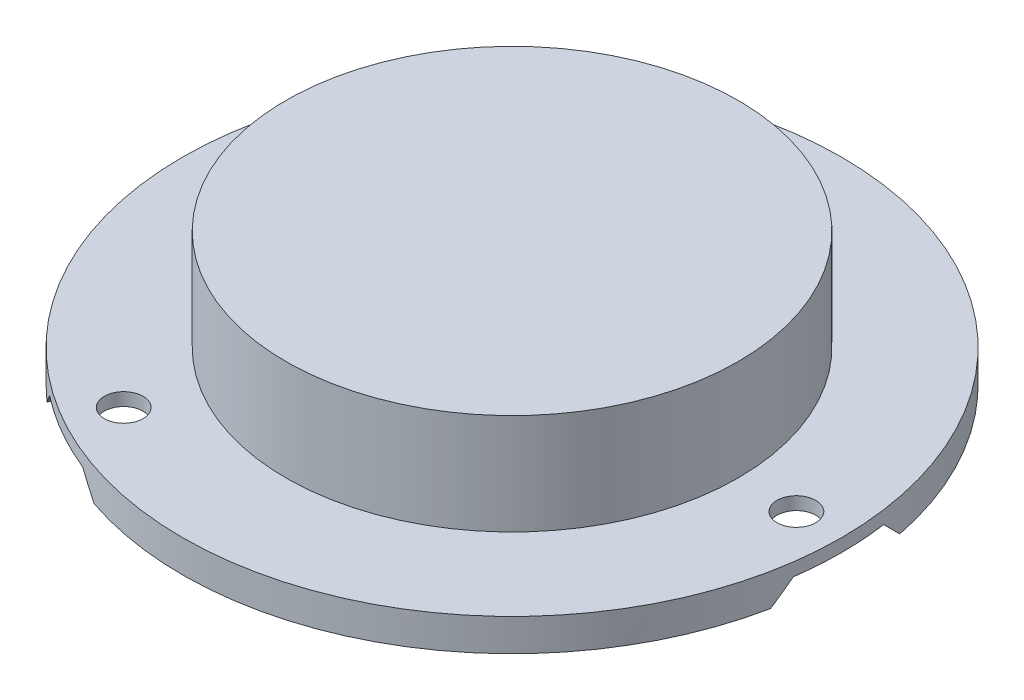
ISO-10303-21;
HEADER;
FILE_DESCRIPTION(('STEP AP214'),'2;1');
FILE_NAME('part.step','',(''),(''),'','','');
FILE_SCHEMA(('AUTOMOTIVE_DESIGN { 1 0 10303 214 1 1 1 1 }'));
ENDSEC;
DATA;
#1=APPLICATION_CONTEXT('core data for automotive mechanical design processes');
#2=APPLICATION_PROTOCOL_DEFINITION('international standard','automotive_design',2000,#1);
#3=PRODUCT_CONTEXT('',#1,'mechanical');
#4=PRODUCT('Part','Part','',(#3));
#5=PRODUCT_RELATED_PRODUCT_CATEGORY('part','',(#4));
#6=PRODUCT_DEFINITION_FORMATION('','',#4);
#7=PRODUCT_DEFINITION_CONTEXT('part definition',#1,'design');
#8=PRODUCT_DEFINITION('design','',#6,#7);
#9=PRODUCT_DEFINITION_SHAPE('','',#8);
#10=(LENGTH_UNIT() NAMED_UNIT(*) SI_UNIT(.MILLI.,.METRE.));
#11=(NAMED_UNIT(*) PLANE_ANGLE_UNIT() SI_UNIT($,.RADIAN.));
#12=(NAMED_UNIT(*) SI_UNIT($,.STERADIAN.) SOLID_ANGLE_UNIT());
#13=UNCERTAINTY_MEASURE_WITH_UNIT(LENGTH_MEASURE(1.E-05),#10,'distance_accuracy_value','');
#14=(GEOMETRIC_REPRESENTATION_CONTEXT(3) GLOBAL_UNCERTAINTY_ASSIGNED_CONTEXT((#13)) GLOBAL_UNIT_ASSIGNED_CONTEXT((#10,
#11,#12)) REPRESENTATION_CONTEXT('',''));
#15=CARTESIAN_POINT('',(0.,0.,0.));
#16=DIRECTION('',(0.,0.,1.));
#17=DIRECTION('',(1.,0.,0.));
#18=AXIS2_PLACEMENT_3D('',#15,#16,#17);
#19=CARTESIAN_POINT('',(-11.0000000000001,0.,-19.0525588832576));
#20=DIRECTION('',(0.,-1.,0.));
#21=DIRECTION('',(0.,0.,-1.));
#22=AXIS2_PLACEMENT_3D('',#19,#20,#21);
#23=CYLINDRICAL_SURFACE('',#22,1.5);
#24=CARTESIAN_POINT('',(-11.0000000000001,2.5,-19.0525588832576));
#25=DIRECTION('',(0.,1.,0.));
#26=DIRECTION('',(-1.,0.,0.));
#27=AXIS2_PLACEMENT_3D('',#24,#25,#26);
#28=CIRCLE('',#27,1.5);
#29=CARTESIAN_POINT('',(-12.5000000000001,2.5,-19.0525588832576));
#30=VERTEX_POINT('',#29);
#31=EDGE_CURVE('E267',#30,#30,#28,.T.);
#32=ORIENTED_EDGE('',*,*,#31,.T.);
#33=EDGE_LOOP('',(#32));
#34=FACE_BOUND('',#33,.T.);
#35=CARTESIAN_POINT('',(-11.0000000000001,1.5,-19.0525588832576));
#36=DIRECTION('',(0.,-1.,0.));
#37=DIRECTION('',(0.,0.,-1.));
#38=AXIS2_PLACEMENT_3D('',#35,#36,#37);
#39=CIRCLE('',#38,1.5);
#40=CARTESIAN_POINT('',(-11.0000000000001,1.5,-20.5525588832576));
#41=VERTEX_POINT('',#40);
#42=EDGE_CURVE('E258',#41,#41,#39,.F.);
#43=ORIENTED_EDGE('',*,*,#42,.F.);
#44=EDGE_LOOP('',(#43));
#45=FACE_BOUND('',#44,.T.);
#46=ADVANCED_FACE('F47',(#34,#45),#23,.F.);
#47=CARTESIAN_POINT('',(-10.9999999999998,0.,19.0525588832577));
#48=DIRECTION('',(0.,-1.,0.));
#49=DIRECTION('',(0.,0.,-1.));
#50=AXIS2_PLACEMENT_3D('',#47,#48,#49);
#51=CYLINDRICAL_SURFACE('',#50,1.5);
#52=CARTESIAN_POINT('',(-10.9999999999998,2.5,19.0525588832577));
#53=DIRECTION('',(0.,1.,0.));
#54=DIRECTION('',(-1.,0.,0.));
#55=AXIS2_PLACEMENT_3D('',#52,#53,#54);
#56=CIRCLE('',#55,1.5);
#57=CARTESIAN_POINT('',(-12.4999999999998,2.5,19.0525588832577));
#58=VERTEX_POINT('',#57);
#59=EDGE_CURVE('E263',#58,#58,#56,.T.);
#60=ORIENTED_EDGE('',*,*,#59,.T.);
#61=EDGE_LOOP('',(#60));
#62=FACE_BOUND('',#61,.T.);
#63=CARTESIAN_POINT('',(-10.9999999999998,1.5,19.0525588832577));
#64=DIRECTION('',(0.,-1.,0.));
#65=DIRECTION('',(0.,0.,-1.));
#66=AXIS2_PLACEMENT_3D('',#63,#64,#65);
#67=CIRCLE('',#66,1.5);
#68=CARTESIAN_POINT('',(-10.9999999999998,1.5,17.5525588832578));
#69=VERTEX_POINT('',#68);
#70=EDGE_CURVE('E243',#69,#69,#67,.F.);
#71=ORIENTED_EDGE('',*,*,#70,.F.);
#72=EDGE_LOOP('',(#71));
#73=FACE_BOUND('',#72,.T.);
#74=ADVANCED_FACE('F464',(#62,#73),#51,.F.);
#75=CARTESIAN_POINT('',(22.,0.,0.));
#76=DIRECTION('',(0.,-1.,0.));
#77=DIRECTION('',(0.,0.,-1.));
#78=AXIS2_PLACEMENT_3D('',#75,#76,#77);
#79=CYLINDRICAL_SURFACE('',#78,1.5);
#80=CARTESIAN_POINT('',(22.,2.5,0.));
#81=DIRECTION('',(0.,1.,0.));
#82=DIRECTION('',(-1.,0.,0.));
#83=AXIS2_PLACEMENT_3D('',#80,#81,#82);
#84=CIRCLE('',#83,1.5);
#85=CARTESIAN_POINT('',(20.5,2.5,0.));
#86=VERTEX_POINT('',#85);
#87=EDGE_CURVE('E288',#86,#86,#84,.T.);
#88=ORIENTED_EDGE('',*,*,#87,.T.);
#89=EDGE_LOOP('',(#88));
#90=FACE_BOUND('',#89,.T.);
#91=CARTESIAN_POINT('',(22.,1.5,0.));
#92=DIRECTION('',(0.,-1.,0.));
#93=DIRECTION('',(1.,0.,0.));
#94=AXIS2_PLACEMENT_3D('',#91,#92,#93);
#95=CIRCLE('',#94,1.5);
#96=CARTESIAN_POINT('',(23.5,1.5,0.));
#97=VERTEX_POINT('',#96);
#98=EDGE_CURVE('E283',#97,#97,#95,.F.);
#99=ORIENTED_EDGE('',*,*,#98,.F.);
#100=EDGE_LOOP('',(#99));
#101=FACE_BOUND('',#100,.T.);
#102=ADVANCED_FACE('F461',(#90,#101),#79,.F.);
#103=CARTESIAN_POINT('',(0.,-9.15,0.));
#104=DIRECTION('',(0.,-1.,0.));
#105=DIRECTION('',(1.,0.,0.));
#106=AXIS2_PLACEMENT_3D('',#103,#104,#105);
#107=SPHERICAL_SURFACE('',#106,0.75);
#108=CARTESIAN_POINT('',(0.,-9.15,0.));
#109=DIRECTION('',(0.,-1.,0.));
#110=DIRECTION('',(1.,0.,0.));
#111=AXIS2_PLACEMENT_3D('',#108,#109,#110);
#112=CIRCLE('',#111,0.750000000000001);
#113=CARTESIAN_POINT('',(0.75,-9.15,0.));
#114=VERTEX_POINT('',#113);
#115=EDGE_CURVE('E292',#114,#114,#112,.T.);
#116=ORIENTED_EDGE('',*,*,#115,.T.);
#117=EDGE_LOOP('',(#116));
#118=FACE_BOUND('',#117,.T.);
#119=ADVANCED_FACE('F463',(#118),#107,.F.);
#120=CARTESIAN_POINT('',(0.,10.3,0.));
#121=DIRECTION('',(0.,1.,0.));
#122=DIRECTION('',(-1.,0.,0.));
#123=AXIS2_PLACEMENT_3D('',#120,#121,#122);
#124=PLANE('',#123);
#125=CARTESIAN_POINT('',(0.,10.3,0.));
#126=DIRECTION('',(0.,-1.,0.));
#127=DIRECTION('',(1.,0.,0.));
#128=AXIS2_PLACEMENT_3D('',#125,#126,#127);
#129=CIRCLE('',#128,17.5);
#130=CARTESIAN_POINT('',(17.5,10.3,0.));
#131=VERTEX_POINT('',#130);
#132=EDGE_CURVE('E341',#131,#131,#129,.T.);
#133=ORIENTED_EDGE('',*,*,#132,.F.);
#134=EDGE_LOOP('',(#133));
#135=FACE_BOUND('',#134,.T.);
#136=ADVANCED_FACE('F471',(#135),#124,.T.);
#137=CARTESIAN_POINT('',(0.,2.5,0.));
#138=DIRECTION('',(0.,-1.,0.));
#139=DIRECTION('',(1.,0.,0.));
#140=AXIS2_PLACEMENT_3D('',#137,#138,#139);
#141=CYLINDRICAL_SURFACE('',#140,17.5);
#142=ORIENTED_EDGE('',*,*,#132,.T.);
#143=EDGE_LOOP('',(#142));
#144=FACE_BOUND('',#143,.T.);
#145=CARTESIAN_POINT('',(0.,2.5,0.));
#146=DIRECTION('',(0.,-1.,0.));
#147=DIRECTION('',(1.,0.,0.));
#148=AXIS2_PLACEMENT_3D('',#145,#146,#147);
#149=CIRCLE('',#148,17.5);
#150=CARTESIAN_POINT('',(17.5,2.5,0.));
#151=VERTEX_POINT('',#150);
#152=EDGE_CURVE('E337',#151,#151,#149,.T.);
#153=ORIENTED_EDGE('',*,*,#152,.F.);
#154=EDGE_LOOP('',(#153));
#155=FACE_BOUND('',#154,.T.);
#156=ADVANCED_FACE('F620',(#144,#155),#141,.T.);
#157=CARTESIAN_POINT('',(25.5,2.5,0.));
#158=DIRECTION('',(0.,1.,0.));
#159=DIRECTION('',(-1.,0.,0.));
#160=AXIS2_PLACEMENT_3D('',#157,#158,#159);
#161=PLANE('',#160);
#162=ORIENTED_EDGE('',*,*,#59,.F.);
#163=EDGE_LOOP('',(#162));
#164=FACE_BOUND('',#163,.T.);
#165=ORIENTED_EDGE('',*,*,#31,.F.);
#166=EDGE_LOOP('',(#165));
#167=FACE_BOUND('',#166,.T.);
#168=ORIENTED_EDGE('',*,*,#87,.F.);
#169=EDGE_LOOP('',(#168));
#170=FACE_BOUND('',#169,.T.);
#171=ORIENTED_EDGE('',*,*,#152,.T.);
#172=EDGE_LOOP('',(#171));
#173=FACE_BOUND('',#172,.T.);
#174=CARTESIAN_POINT('',(0.,2.5,0.));
#175=DIRECTION('',(0.,-1.,0.));
#176=DIRECTION('',(1.,0.,0.));
#177=AXIS2_PLACEMENT_3D('',#174,#175,#176);
#178=CIRCLE('',#177,25.5);
#179=CARTESIAN_POINT('',(25.5,2.5,0.));
#180=VERTEX_POINT('',#179);
#181=EDGE_CURVE('E332',#180,#180,#178,.T.);
#182=ORIENTED_EDGE('',*,*,#181,.F.);
#183=EDGE_LOOP('',(#182));
#184=FACE_BOUND('',#183,.T.);
#185=ADVANCED_FACE('F617',(#164,#167,#170,#173,#184),#161,.T.);
#186=CARTESIAN_POINT('',(0.,2.5,0.));
#187=DIRECTION('',(0.,-1.,0.));
#188=DIRECTION('',(1.,0.,0.));
#189=AXIS2_PLACEMENT_3D('',#186,#187,#188);
#190=CYLINDRICAL_SURFACE('',#189,25.5);
#191=CARTESIAN_POINT('',(0.,1.5,0.));
#192=DIRECTION('',(0.,-1.,0.));
#193=DIRECTION('',(0.,0.,-1.));
#194=AXIS2_PLACEMENT_3D('',#191,#192,#193);
#195=CIRCLE('',#194,25.5);
#196=CARTESIAN_POINT('',(-15.6604198535604,1.5,20.1246428542275));
#197=VERTEX_POINT('',#196);
#198=CARTESIAN_POINT('',(-9.59824202706933,1.5,23.6246428542274));
#199=VERTEX_POINT('',#198);
#200=EDGE_CURVE('E254',#197,#199,#195,.F.);
#201=ORIENTED_EDGE('',*,*,#200,.T.);
#202=CARTESIAN_POINT('',(0.,4.99999999999998,0.));
#203=DIRECTION('',(-0.612372435695796,-0.70710678118655,-0.353553390593267));
#204=DIRECTION('',(0.6123724356958,-0.707106781186546,0.353553390593269));
#205=AXIS2_PLACEMENT_3D('',#202,#203,#204);
#206=ELLIPSE('',#205,36.0624458405138,25.5);
#207=CARTESIAN_POINT('',(-8.17237273112756,0.,24.1549647887038));
#208=VERTEX_POINT('',#207);
#209=EDGE_CURVE('E402',#199,#208,#206,.F.);
#210=ORIENTED_EDGE('',*,*,#209,.T.);
#211=CARTESIAN_POINT('',(0.,0.,0.));
#212=DIRECTION('',(0.,-1.,0.));
#213=DIRECTION('',(1.,0.,0.));
#214=AXIS2_PLACEMENT_3D('',#211,#212,#213);
#215=CIRCLE('',#214,25.5);
#216=CARTESIAN_POINT('',(25.0049995001,0.,5.00000000000001));
#217=VERTEX_POINT('',#216);
#218=EDGE_CURVE('E329',#217,#208,#215,.T.);
#219=ORIENTED_EDGE('',*,*,#218,.F.);
#220=CARTESIAN_POINT('',(0.,4.99999999999998,0.));
#221=DIRECTION('',(0.,-0.70710678118655,-0.707106781186545));
#222=DIRECTION('',(0.,-0.707106781186545,0.70710678118655));
#223=AXIS2_PLACEMENT_3D('',#220,#221,#222);
#224=ELLIPSE('',#223,36.0624458405138,25.5);
#225=CARTESIAN_POINT('',(25.2586618806302,1.5,3.5));
#226=VERTEX_POINT('',#225);
#227=EDGE_CURVE('E345',#217,#226,#224,.F.);
#228=ORIENTED_EDGE('',*,*,#227,.T.);
#229=CARTESIAN_POINT('',(0.,1.5,0.));
#230=DIRECTION('',(0.,-1.,0.));
#231=DIRECTION('',(1.,0.,0.));
#232=AXIS2_PLACEMENT_3D('',#229,#230,#231);
#233=CIRCLE('',#232,25.5);
#234=CARTESIAN_POINT('',(25.2586618806302,1.5,-3.5));
#235=VERTEX_POINT('',#234);
#236=EDGE_CURVE('E284',#226,#235,#233,.F.);
#237=ORIENTED_EDGE('',*,*,#236,.T.);
#238=CARTESIAN_POINT('',(0.,4.99999999999998,0.));
#239=DIRECTION('',(0.,-0.70710678118655,0.707106781186545));
#240=DIRECTION('',(0.,-0.707106781186545,-0.70710678118655));
#241=AXIS2_PLACEMENT_3D('',#238,#239,#240);
#242=ELLIPSE('',#241,36.0624458405138,25.5);
#243=CARTESIAN_POINT('',(25.0049995001,0.,-5.00000000000001));
#244=VERTEX_POINT('',#243);
#245=EDGE_CURVE('E351',#235,#244,#242,.F.);
#246=ORIENTED_EDGE('',*,*,#245,.T.);
#247=CARTESIAN_POINT('',(-8.17237273112789,0.,-24.1549647887037));
#248=VERTEX_POINT('',#247);
#249=EDGE_CURVE('E328',#248,#244,#215,.T.);
#250=ORIENTED_EDGE('',*,*,#249,.F.);
#251=CARTESIAN_POINT('',(0.,4.99999999999996,0.));
#252=DIRECTION('',(-0.612372435695789,-0.707106781186552,0.353553390593275));
#253=DIRECTION('',(0.612372435695796,-0.707106781186544,-0.353553390593279));
#254=AXIS2_PLACEMENT_3D('',#251,#252,#253);
#255=ELLIPSE('',#254,36.0624458405137,25.5);
#256=CARTESIAN_POINT('',(-9.59824202706966,1.5,-23.6246428542273));
#257=VERTEX_POINT('',#256);
#258=EDGE_CURVE('E364',#248,#257,#255,.F.);
#259=ORIENTED_EDGE('',*,*,#258,.T.);
#260=CARTESIAN_POINT('',(0.,1.5,0.));
#261=DIRECTION('',(0.,-1.,0.));
#262=DIRECTION('',(0.,0.,-1.));
#263=AXIS2_PLACEMENT_3D('',#260,#261,#262);
#264=CIRCLE('',#263,25.5);
#265=CARTESIAN_POINT('',(-15.6604198535607,1.5,-20.1246428542273));
#266=VERTEX_POINT('',#265);
#267=EDGE_CURVE('E259',#257,#266,#264,.F.);
#268=ORIENTED_EDGE('',*,*,#267,.T.);
#269=CARTESIAN_POINT('',(0.,4.99999999999996,0.));
#270=DIRECTION('',(0.612372435695789,-0.707106781186552,-0.353553390593275));
#271=DIRECTION('',(-0.612372435695796,-0.707106781186543,0.353553390593279));
#272=AXIS2_PLACEMENT_3D('',#269,#270,#271);
#273=ELLIPSE('',#272,36.0624458405137,25.5);
#274=CARTESIAN_POINT('',(-16.8326267689723,0.,-19.1549647887037));
#275=VERTEX_POINT('',#274);
#276=EDGE_CURVE('E379',#266,#275,#273,.F.);
#277=ORIENTED_EDGE('',*,*,#276,.T.);
#278=CARTESIAN_POINT('',(-16.832626768972,0.,19.1549647887039));
#279=VERTEX_POINT('',#278);
#280=EDGE_CURVE('E333',#279,#275,#215,.T.);
#281=ORIENTED_EDGE('',*,*,#280,.F.);
#282=CARTESIAN_POINT('',(0.,4.99999999999997,0.));
#283=DIRECTION('',(0.612372435695796,-0.70710678118655,0.353553390593267));
#284=DIRECTION('',(-0.6123724356958,-0.707106781186545,-0.353553390593269));
#285=AXIS2_PLACEMENT_3D('',#282,#283,#284);
#286=ELLIPSE('',#285,36.0624458405138,25.5);
#287=EDGE_CURVE('E392',#279,#197,#286,.F.);
#288=ORIENTED_EDGE('',*,*,#287,.T.);
#289=EDGE_LOOP('',(#201,#210,#219,#228,#237,#246,#250,#259,#268,#277,#281,#288));
#290=FACE_BOUND('',#289,.T.);
#291=ORIENTED_EDGE('',*,*,#181,.T.);
#292=EDGE_LOOP('',(#291));
#293=FACE_BOUND('',#292,.T.);
#294=ADVANCED_FACE('F427',(#290,#293),#190,.T.);
#295=CARTESIAN_POINT('',(16.,0.,0.));
#296=DIRECTION('',(0.,-1.,0.));
#297=DIRECTION('',(1.,0.,0.));
#298=AXIS2_PLACEMENT_3D('',#295,#296,#297);
#299=PLANE('',#298);
#300=ORIENTED_EDGE('',*,*,#218,.T.);
#301=DIRECTION('',(0.499999999999992,0.,-0.866025403784443));
#302=VECTOR('',#301,1.);
#303=CARTESIAN_POINT('',(-6.6698729810776,0.,21.5525588832577));
#304=LINE('',#303,#302);
#305=CARTESIAN_POINT('',(-6.6698729810776,0.,21.5525588832577));
#306=VERTEX_POINT('',#305);
#307=EDGE_CURVE('E11',#208,#306,#304,.T.);
#308=ORIENTED_EDGE('',*,*,#307,.T.);
#309=CARTESIAN_POINT('',(-10.9999999999998,0.,19.0525588832577));
#310=DIRECTION('',(0.,-1.,0.));
#311=DIRECTION('',(1.,0.,0.));
#312=AXIS2_PLACEMENT_3D('',#309,#310,#311);
#313=CIRCLE('',#312,5.00000000000001);
#314=CARTESIAN_POINT('',(-15.330127018922,0.,16.5525588832578));
#315=VERTEX_POINT('',#314);
#316=EDGE_CURVE('E58',#306,#315,#313,.F.);
#317=ORIENTED_EDGE('',*,*,#316,.T.);
#318=DIRECTION('',(-0.499999999999992,0.,0.866025403784443));
#319=VECTOR('',#318,1.);
#320=CARTESIAN_POINT('',(-16.9594579592371,0.,19.3746428542275));
#321=LINE('',#320,#319);
#322=EDGE_CURVE('E405',#315,#279,#321,.T.);
#323=ORIENTED_EDGE('',*,*,#322,.T.);
#324=ORIENTED_EDGE('',*,*,#280,.T.);
#325=DIRECTION('',(0.500000000000004,0.,0.866025403784436));
#326=VECTOR('',#325,1.);
#327=CARTESIAN_POINT('',(-15.3301270189223,0.,-16.5525588832576));
#328=LINE('',#327,#326);
#329=CARTESIAN_POINT('',(-15.3301270189223,0.,-16.5525588832576));
#330=VERTEX_POINT('',#329);
#331=EDGE_CURVE('E389',#275,#330,#328,.T.);
#332=ORIENTED_EDGE('',*,*,#331,.T.);
#333=CARTESIAN_POINT('',(-11.0000000000001,0.,-19.0525588832576));
#334=DIRECTION('',(0.,-1.,0.));
#335=DIRECTION('',(1.,0.,0.));
#336=AXIS2_PLACEMENT_3D('',#333,#334,#335);
#337=CIRCLE('',#336,5.00000000000002);
#338=CARTESIAN_POINT('',(-6.66987298107789,0.,-21.5525588832576));
#339=VERTEX_POINT('',#338);
#340=EDGE_CURVE('E386',#330,#339,#337,.F.);
#341=ORIENTED_EDGE('',*,*,#340,.T.);
#342=DIRECTION('',(-0.500000000000004,0.,-0.866025403784436));
#343=VECTOR('',#342,1.);
#344=CARTESIAN_POINT('',(-8.29920392139299,0.,-24.3746428542273));
#345=LINE('',#344,#343);
#346=EDGE_CURVE('E383',#339,#248,#345,.T.);
#347=ORIENTED_EDGE('',*,*,#346,.T.);
#348=ORIENTED_EDGE('',*,*,#249,.T.);
#349=DIRECTION('',(-1.,0.,0.));
#350=VECTOR('',#349,1.);
#351=CARTESIAN_POINT('',(22.,0.,-5.00000000000001));
#352=LINE('',#351,#350);
#353=CARTESIAN_POINT('',(22.,0.,-5.00000000000001));
#354=VERTEX_POINT('',#353);
#355=EDGE_CURVE('E361',#244,#354,#352,.T.);
#356=ORIENTED_EDGE('',*,*,#355,.T.);
#357=CARTESIAN_POINT('',(22.,0.,0.));
#358=DIRECTION('',(0.,-1.,0.));
#359=DIRECTION('',(1.,0.,0.));
#360=AXIS2_PLACEMENT_3D('',#357,#358,#359);
#361=CIRCLE('',#360,5.00000000000001);
#362=CARTESIAN_POINT('',(22.,0.,5.00000000000001));
#363=VERTEX_POINT('',#362);
#364=EDGE_CURVE('E358',#354,#363,#361,.F.);
#365=ORIENTED_EDGE('',*,*,#364,.T.);
#366=DIRECTION('',(1.,0.,0.));
#367=VECTOR('',#366,1.);
#368=CARTESIAN_POINT('',(25.2586618806302,0.,5.00000000000001));
#369=LINE('',#368,#367);
#370=EDGE_CURVE('E355',#363,#217,#369,.T.);
#371=ORIENTED_EDGE('',*,*,#370,.T.);
#372=EDGE_LOOP('',(#300,#308,#317,#323,#324,#332,#341,#347,#348,#356,#365,#371));
#373=FACE_BOUND('',#372,.T.);
#374=CARTESIAN_POINT('',(0.,0.,0.));
#375=DIRECTION('',(0.,-1.,0.));
#376=DIRECTION('',(1.,0.,0.));
#377=AXIS2_PLACEMENT_3D('',#374,#375,#376);
#378=CIRCLE('',#377,16.);
#379=CARTESIAN_POINT('',(16.,0.,0.));
#380=VERTEX_POINT('',#379);
#381=EDGE_CURVE('E324',#380,#380,#378,.T.);
#382=ORIENTED_EDGE('',*,*,#381,.F.);
#383=EDGE_LOOP('',(#382));
#384=FACE_BOUND('',#383,.T.);
#385=ADVANCED_FACE('F424',(#373,#384),#299,.T.);
#386=CARTESIAN_POINT('',(0.,2.5,0.));
#387=DIRECTION('',(0.,-1.,0.));
#388=DIRECTION('',(1.,0.,0.));
#389=AXIS2_PLACEMENT_3D('',#386,#387,#388);
#390=CYLINDRICAL_SURFACE('',#389,16.);
#391=ORIENTED_EDGE('',*,*,#381,.T.);
#392=EDGE_LOOP('',(#391));
#393=FACE_BOUND('',#392,.T.);
#394=CARTESIAN_POINT('',(0.,-0.799999999999999,0.));
#395=DIRECTION('',(0.,-1.,0.));
#396=DIRECTION('',(1.,0.,0.));
#397=AXIS2_PLACEMENT_3D('',#394,#395,#396);
#398=CIRCLE('',#397,16.);
#399=CARTESIAN_POINT('',(16.,-0.8,0.));
#400=VERTEX_POINT('',#399);
#401=EDGE_CURVE('E320',#400,#400,#398,.T.);
#402=ORIENTED_EDGE('',*,*,#401,.F.);
#403=EDGE_LOOP('',(#402));
#404=FACE_BOUND('',#403,.T.);
#405=ADVANCED_FACE('F608',(#393,#404),#390,.T.);
#406=CARTESIAN_POINT('',(12.5,-0.8,0.));
#407=DIRECTION('',(0.,-1.,0.));
#408=DIRECTION('',(1.,0.,0.));
#409=AXIS2_PLACEMENT_3D('',#406,#407,#408);
#410=PLANE('',#409);
#411=ORIENTED_EDGE('',*,*,#401,.T.);
#412=EDGE_LOOP('',(#411));
#413=FACE_BOUND('',#412,.T.);
#414=CARTESIAN_POINT('',(0.,-0.799999999999999,0.));
#415=DIRECTION('',(0.,-1.,0.));
#416=DIRECTION('',(1.,0.,0.));
#417=AXIS2_PLACEMENT_3D('',#414,#415,#416);
#418=CIRCLE('',#417,12.5);
#419=CARTESIAN_POINT('',(12.5,-0.8,0.));
#420=VERTEX_POINT('',#419);
#421=EDGE_CURVE('E316',#420,#420,#418,.T.);
#422=ORIENTED_EDGE('',*,*,#421,.F.);
#423=EDGE_LOOP('',(#422));
#424=FACE_BOUND('',#423,.T.);
#425=ADVANCED_FACE('F604',(#413,#424),#410,.T.);
#426=CARTESIAN_POINT('',(0.,2.5,0.));
#427=DIRECTION('',(0.,-1.,0.));
#428=DIRECTION('',(1.,0.,0.));
#429=AXIS2_PLACEMENT_3D('',#426,#427,#428);
#430=CYLINDRICAL_SURFACE('',#429,12.5);
#431=ORIENTED_EDGE('',*,*,#421,.T.);
#432=EDGE_LOOP('',(#431));
#433=FACE_BOUND('',#432,.T.);
#434=CARTESIAN_POINT('',(0.,-6.4,0.));
#435=DIRECTION('',(0.,-1.,0.));
#436=DIRECTION('',(1.,0.,0.));
#437=AXIS2_PLACEMENT_3D('',#434,#435,#436);
#438=CIRCLE('',#437,12.5);
#439=CARTESIAN_POINT('',(12.5,-6.4,0.));
#440=VERTEX_POINT('',#439);
#441=EDGE_CURVE('E312',#440,#440,#438,.T.);
#442=ORIENTED_EDGE('',*,*,#441,.F.);
#443=EDGE_LOOP('',(#442));
#444=FACE_BOUND('',#443,.T.);
#445=ADVANCED_FACE('F559',(#433,#444),#430,.T.);
#446=CARTESIAN_POINT('',(7.5,-6.4,0.));
#447=DIRECTION('',(0.,-1.,0.));
#448=DIRECTION('',(1.,0.,0.));
#449=AXIS2_PLACEMENT_3D('',#446,#447,#448);
#450=PLANE('',#449);
#451=CARTESIAN_POINT('',(7.07106781186556,-6.4,7.07106781186539));
#452=DIRECTION('',(0.,-1.,0.));
#453=DIRECTION('',(0.,0.,-1.));
#454=AXIS2_PLACEMENT_3D('',#451,#452,#453);
#455=CIRCLE('',#454,0.79999999999999);
#456=CARTESIAN_POINT('',(7.07106781186556,-6.4,6.2710678118654));
#457=VERTEX_POINT('',#456);
#458=EDGE_CURVE('E170',#457,#457,#455,.T.);
#459=ORIENTED_EDGE('',*,*,#458,.F.);
#460=EDGE_LOOP('',(#459));
#461=FACE_BOUND('',#460,.T.);
#462=CARTESIAN_POINT('',(1.04744440165294E-13,-6.4,10.));
#463=DIRECTION('',(0.,-1.,0.));
#464=DIRECTION('',(0.,0.,-1.));
#465=AXIS2_PLACEMENT_3D('',#462,#463,#464);
#466=CIRCLE('',#465,0.79999999999999);
#467=CARTESIAN_POINT('',(1.04744440165294E-13,-6.4,9.20000000000001));
#468=VERTEX_POINT('',#467);
#469=EDGE_CURVE('E169',#468,#468,#466,.T.);
#470=ORIENTED_EDGE('',*,*,#469,.F.);
#471=EDGE_LOOP('',(#470));
#472=FACE_BOUND('',#471,.T.);
#473=CARTESIAN_POINT('',(-7.07106781186541,-6.4,7.07106781186554));
#474=DIRECTION('',(0.,-1.,0.));
#475=DIRECTION('',(0.,0.,-1.));
#476=AXIS2_PLACEMENT_3D('',#473,#474,#475);
#477=CIRCLE('',#476,0.79999999999999);
#478=CARTESIAN_POINT('',(-7.07106781186541,-6.4,6.27106781186555));
#479=VERTEX_POINT('',#478);
#480=EDGE_CURVE('E183',#479,#479,#477,.T.);
#481=ORIENTED_EDGE('',*,*,#480,.F.);
#482=EDGE_LOOP('',(#481));
#483=FACE_BOUND('',#482,.T.);
#484=CARTESIAN_POINT('',(-10.,-6.4,0.));
#485=DIRECTION('',(0.,-1.,0.));
#486=DIRECTION('',(0.,0.,-1.));
#487=AXIS2_PLACEMENT_3D('',#484,#485,#486);
#488=CIRCLE('',#487,0.79999999999999);
#489=CARTESIAN_POINT('',(-10.,-6.4,-0.79999999999999));
#490=VERTEX_POINT('',#489);
#491=EDGE_CURVE('E191',#490,#490,#488,.T.);
#492=ORIENTED_EDGE('',*,*,#491,.F.);
#493=EDGE_LOOP('',(#492));
#494=FACE_BOUND('',#493,.T.);
#495=CARTESIAN_POINT('',(-7.07106781186551,-6.4,-7.07106781186544));
#496=DIRECTION('',(0.,-1.,0.));
#497=DIRECTION('',(0.,0.,-1.));
#498=AXIS2_PLACEMENT_3D('',#495,#496,#497);
#499=CIRCLE('',#498,0.79999999999999);
#500=CARTESIAN_POINT('',(-7.07106781186551,-6.4,-7.87106781186543));
#501=VERTEX_POINT('',#500);
#502=EDGE_CURVE('E199',#501,#501,#499,.T.);
#503=ORIENTED_EDGE('',*,*,#502,.F.);
#504=EDGE_LOOP('',(#503));
#505=FACE_BOUND('',#504,.T.);
#506=CARTESIAN_POINT('',(0.,-6.4,-10.));
#507=DIRECTION('',(0.,-1.,0.));
#508=DIRECTION('',(0.,0.,-1.));
#509=AXIS2_PLACEMENT_3D('',#506,#507,#508);
#510=CIRCLE('',#509,0.79999999999999);
#511=CARTESIAN_POINT('',(0.,-6.4,-10.8));
#512=VERTEX_POINT('',#511);
#513=EDGE_CURVE('E207',#512,#512,#510,.T.);
#514=ORIENTED_EDGE('',*,*,#513,.F.);
#515=EDGE_LOOP('',(#514));
#516=FACE_BOUND('',#515,.T.);
#517=CARTESIAN_POINT('',(7.07106781186546,-6.4,-7.07106781186549));
#518=DIRECTION('',(0.,-1.,0.));
#519=DIRECTION('',(0.,0.,-1.));
#520=AXIS2_PLACEMENT_3D('',#517,#518,#519);
#521=CIRCLE('',#520,0.79999999999999);
#522=CARTESIAN_POINT('',(7.07106781186546,-6.4,-7.87106781186548));
#523=VERTEX_POINT('',#522);
#524=EDGE_CURVE('E215',#523,#523,#521,.T.);
#525=ORIENTED_EDGE('',*,*,#524,.F.);
#526=EDGE_LOOP('',(#525));
#527=FACE_BOUND('',#526,.T.);
#528=CARTESIAN_POINT('',(10.,-6.4,0.));
#529=DIRECTION('',(0.,-1.,0.));
#530=DIRECTION('',(0.,0.,-1.));
#531=AXIS2_PLACEMENT_3D('',#528,#529,#530);
#532=CIRCLE('',#531,0.79999999999999);
#533=CARTESIAN_POINT('',(10.,-6.4,-0.79999999999999));
#534=VERTEX_POINT('',#533);
#535=EDGE_CURVE('E223',#534,#534,#532,.T.);
#536=ORIENTED_EDGE('',*,*,#535,.F.);
#537=EDGE_LOOP('',(#536));
#538=FACE_BOUND('',#537,.T.);
#539=ORIENTED_EDGE('',*,*,#441,.T.);
#540=EDGE_LOOP('',(#539));
#541=FACE_BOUND('',#540,.T.);
#542=CARTESIAN_POINT('',(0.,-6.4,0.));
#543=DIRECTION('',(0.,-1.,0.));
#544=DIRECTION('',(1.,0.,0.));
#545=AXIS2_PLACEMENT_3D('',#542,#543,#544);
#546=CIRCLE('',#545,7.5);
#547=CARTESIAN_POINT('',(7.5,-6.4,0.));
#548=VERTEX_POINT('',#547);
#549=EDGE_CURVE('E308',#548,#548,#546,.T.);
#550=ORIENTED_EDGE('',*,*,#549,.F.);
#551=EDGE_LOOP('',(#550));
#552=FACE_BOUND('',#551,.T.);
#553=ADVANCED_FACE('F555',(#461,#472,#483,#494,#505,#516,#527,#538,#541,#552),#450,.T.);
#554=CARTESIAN_POINT('',(0.,2.5,0.));
#555=DIRECTION('',(0.,-1.,0.));
#556=DIRECTION('',(1.,0.,0.));
#557=AXIS2_PLACEMENT_3D('',#554,#555,#556);
#558=CYLINDRICAL_SURFACE('',#557,7.5);
#559=ORIENTED_EDGE('',*,*,#549,.T.);
#560=EDGE_LOOP('',(#559));
#561=FACE_BOUND('',#560,.T.);
#562=CARTESIAN_POINT('',(0.,-8.9,0.));
#563=DIRECTION('',(0.,-1.,0.));
#564=DIRECTION('',(1.,0.,0.));
#565=AXIS2_PLACEMENT_3D('',#562,#563,#564);
#566=CIRCLE('',#565,7.5);
#567=CARTESIAN_POINT('',(7.5,-8.9,0.));
#568=VERTEX_POINT('',#567);
#569=EDGE_CURVE('E304',#568,#568,#566,.T.);
#570=ORIENTED_EDGE('',*,*,#569,.F.);
#571=EDGE_LOOP('',(#570));
#572=FACE_BOUND('',#571,.T.);
#573=ADVANCED_FACE('F558',(#561,#572),#558,.T.);
#574=CARTESIAN_POINT('',(2.,-8.9,0.));
#575=DIRECTION('',(0.,-1.,0.));
#576=DIRECTION('',(1.,0.,0.));
#577=AXIS2_PLACEMENT_3D('',#574,#575,#576);
#578=PLANE('',#577);
#579=ORIENTED_EDGE('',*,*,#569,.T.);
#580=EDGE_LOOP('',(#579));
#581=FACE_BOUND('',#580,.T.);
#582=CARTESIAN_POINT('',(0.,-8.9,0.));
#583=DIRECTION('',(0.,-1.,0.));
#584=DIRECTION('',(1.,0.,0.));
#585=AXIS2_PLACEMENT_3D('',#582,#583,#584);
#586=CIRCLE('',#585,2.);
#587=CARTESIAN_POINT('',(2.,-8.9,0.));
#588=VERTEX_POINT('',#587);
#589=EDGE_CURVE('E300',#588,#588,#586,.T.);
#590=ORIENTED_EDGE('',*,*,#589,.F.);
#591=EDGE_LOOP('',(#590));
#592=FACE_BOUND('',#591,.T.);
#593=ADVANCED_FACE('F581',(#581,#592),#578,.T.);
#594=CARTESIAN_POINT('',(0.,2.5,0.));
#595=DIRECTION('',(0.,-1.,0.));
#596=DIRECTION('',(1.,0.,0.));
#597=AXIS2_PLACEMENT_3D('',#594,#595,#596);
#598=CYLINDRICAL_SURFACE('',#597,2.);
#599=ORIENTED_EDGE('',*,*,#589,.T.);
#600=EDGE_LOOP('',(#599));
#601=FACE_BOUND('',#600,.T.);
#602=CARTESIAN_POINT('',(0.,-9.15,0.));
#603=DIRECTION('',(0.,-1.,0.));
#604=DIRECTION('',(1.,0.,0.));
#605=AXIS2_PLACEMENT_3D('',#602,#603,#604);
#606=CIRCLE('',#605,2.);
#607=CARTESIAN_POINT('',(2.,-9.15,0.));
#608=VERTEX_POINT('',#607);
#609=EDGE_CURVE('E296',#608,#608,#606,.T.);
#610=ORIENTED_EDGE('',*,*,#609,.F.);
#611=EDGE_LOOP('',(#610));
#612=FACE_BOUND('',#611,.T.);
#613=ADVANCED_FACE('F587',(#601,#612),#598,.T.);
#614=CARTESIAN_POINT('',(0.75,-9.15,0.));
#615=DIRECTION('',(0.,-1.,0.));
#616=DIRECTION('',(1.,0.,0.));
#617=AXIS2_PLACEMENT_3D('',#614,#615,#616);
#618=PLANE('',#617);
#619=ORIENTED_EDGE('',*,*,#609,.T.);
#620=EDGE_LOOP('',(#619));
#621=FACE_BOUND('',#620,.T.);
#622=ORIENTED_EDGE('',*,*,#115,.F.);
#623=EDGE_LOOP('',(#622));
#624=FACE_BOUND('',#623,.T.);
#625=ADVANCED_FACE('F457',(#621,#624),#618,.T.);
#626=CARTESIAN_POINT('',(22.,1.5,0.));
#627=DIRECTION('',(0.,-1.,0.));
#628=DIRECTION('',(1.,0.,0.));
#629=AXIS2_PLACEMENT_3D('',#626,#627,#628);
#630=PLANE('',#629);
#631=ORIENTED_EDGE('',*,*,#236,.F.);
#632=DIRECTION('',(-1.,0.,0.));
#633=VECTOR('',#632,1.);
#634=CARTESIAN_POINT('',(22.,1.5,3.5));
#635=LINE('',#634,#633);
#636=CARTESIAN_POINT('',(22.,1.5,3.5));
#637=VERTEX_POINT('',#636);
#638=EDGE_CURVE('E280',#226,#637,#635,.T.);
#639=ORIENTED_EDGE('',*,*,#638,.T.);
#640=CARTESIAN_POINT('',(22.,1.5,0.));
#641=DIRECTION('',(0.,-1.,0.));
#642=DIRECTION('',(1.,0.,0.));
#643=AXIS2_PLACEMENT_3D('',#640,#641,#642);
#644=CIRCLE('',#643,3.5);
#645=CARTESIAN_POINT('',(22.,1.5,-3.5));
#646=VERTEX_POINT('',#645);
#647=EDGE_CURVE('E272',#637,#646,#644,.T.);
#648=ORIENTED_EDGE('',*,*,#647,.T.);
#649=DIRECTION('',(1.,0.,0.));
#650=VECTOR('',#649,1.);
#651=CARTESIAN_POINT('',(22.,1.5,-3.5));
#652=LINE('',#651,#650);
#653=EDGE_CURVE('E275',#646,#235,#652,.T.);
#654=ORIENTED_EDGE('',*,*,#653,.T.);
#655=EDGE_LOOP('',(#631,#639,#648,#654));
#656=FACE_BOUND('',#655,.T.);
#657=ORIENTED_EDGE('',*,*,#98,.T.);
#658=EDGE_LOOP('',(#657));
#659=FACE_BOUND('',#658,.T.);
#660=ADVANCED_FACE('F454',(#656,#659),#630,.T.);
#661=CARTESIAN_POINT('',(22.,1.5,3.5));
#662=DIRECTION('',(0.,-0.70710678118655,-0.707106781186545));
#663=DIRECTION('',(1.,0.,0.));
#664=AXIS2_PLACEMENT_3D('',#661,#662,#663);
#665=PLANE('',#664);
#666=ORIENTED_EDGE('',*,*,#227,.F.);
#667=ORIENTED_EDGE('',*,*,#370,.F.);
#668=DIRECTION('',(0.,-0.707106781186545,0.70710678118655));
#669=VECTOR('',#668,1.);
#670=CARTESIAN_POINT('',(22.,1.5,3.5));
#671=LINE('',#670,#669);
#672=EDGE_CURVE('E276',#637,#363,#671,.T.);
#673=ORIENTED_EDGE('',*,*,#672,.F.);
#674=ORIENTED_EDGE('',*,*,#638,.F.);
#675=EDGE_LOOP('',(#666,#667,#673,#674));
#676=FACE_BOUND('',#675,.T.);
#677=ADVANCED_FACE('F451',(#676),#665,.T.);
#678=CARTESIAN_POINT('',(22.,1.5,0.));
#679=DIRECTION('',(0.,-1.,0.));
#680=DIRECTION('',(0.,0.,-1.));
#681=AXIS2_PLACEMENT_3D('',#678,#679,#680);
#682=CONICAL_SURFACE('',#681,3.5,0.78539816339745);
#683=ORIENTED_EDGE('',*,*,#672,.T.);
#684=ORIENTED_EDGE('',*,*,#364,.F.);
#685=DIRECTION('',(0.,-0.707106781186546,-0.707106781186549));
#686=VECTOR('',#685,1.);
#687=CARTESIAN_POINT('',(22.,1.5,-3.5));
#688=LINE('',#687,#686);
#689=EDGE_CURVE('E271',#646,#354,#688,.T.);
#690=ORIENTED_EDGE('',*,*,#689,.F.);
#691=ORIENTED_EDGE('',*,*,#647,.F.);
#692=EDGE_LOOP('',(#683,#684,#690,#691));
#693=FACE_BOUND('',#692,.T.);
#694=ADVANCED_FACE('F445',(#693),#682,.F.);
#695=CARTESIAN_POINT('',(22.,1.5,-3.5));
#696=DIRECTION('',(0.,-0.70710678118655,0.707106781186545));
#697=DIRECTION('',(-1.,0.,0.));
#698=AXIS2_PLACEMENT_3D('',#695,#696,#697);
#699=PLANE('',#698);
#700=ORIENTED_EDGE('',*,*,#689,.T.);
#701=ORIENTED_EDGE('',*,*,#355,.F.);
#702=ORIENTED_EDGE('',*,*,#245,.F.);
#703=ORIENTED_EDGE('',*,*,#653,.F.);
#704=EDGE_LOOP('',(#700,#701,#702,#703));
#705=FACE_BOUND('',#704,.T.);
#706=ADVANCED_FACE('F441',(#705),#699,.T.);
#707=CARTESIAN_POINT('',(-10.9999999999998,1.5,19.0525588832577));
#708=DIRECTION('',(0.,-1.,0.));
#709=DIRECTION('',(-0.499999999999992,0.,0.866025403784443));
#710=AXIS2_PLACEMENT_3D('',#707,#708,#709);
#711=PLANE('',#710);
#712=DIRECTION('',(0.499999999999992,0.,-0.866025403784443));
#713=VECTOR('',#712,1.);
#714=CARTESIAN_POINT('',(-14.0310889132454,1.5,17.3025588832578));
#715=LINE('',#714,#713);
#716=CARTESIAN_POINT('',(-14.0310889132454,1.5,17.3025588832578));
#717=VERTEX_POINT('',#716);
#718=EDGE_CURVE('E236',#197,#717,#715,.T.);
#719=ORIENTED_EDGE('',*,*,#718,.T.);
#720=CARTESIAN_POINT('',(-10.9999999999998,1.5,19.0525588832577));
#721=DIRECTION('',(0.,-1.,0.));
#722=DIRECTION('',(-0.499999999999992,0.,0.866025403784443));
#723=AXIS2_PLACEMENT_3D('',#720,#721,#722);
#724=CIRCLE('',#723,3.5);
#725=CARTESIAN_POINT('',(-7.96891108675427,1.5,20.8025588832577));
#726=VERTEX_POINT('',#725);
#727=EDGE_CURVE('E244',#717,#726,#724,.T.);
#728=ORIENTED_EDGE('',*,*,#727,.T.);
#729=DIRECTION('',(-0.499999999999992,0.,0.866025403784443));
#730=VECTOR('',#729,1.);
#731=CARTESIAN_POINT('',(-7.96891108675427,1.5,20.8025588832577));
#732=LINE('',#731,#730);
#733=EDGE_CURVE('E247',#726,#199,#732,.T.);
#734=ORIENTED_EDGE('',*,*,#733,.T.);
#735=ORIENTED_EDGE('',*,*,#200,.F.);
#736=EDGE_LOOP('',(#719,#728,#734,#735));
#737=FACE_BOUND('',#736,.T.);
#738=ORIENTED_EDGE('',*,*,#70,.T.);
#739=EDGE_LOOP('',(#738));
#740=FACE_BOUND('',#739,.T.);
#741=ADVANCED_FACE('F484',(#737,#740),#711,.T.);
#742=CARTESIAN_POINT('',(-11.0000000000001,1.5,-19.0525588832576));
#743=DIRECTION('',(0.,-1.,0.));
#744=DIRECTION('',(-0.500000000000004,0.,-0.866025403784436));
#745=AXIS2_PLACEMENT_3D('',#742,#743,#744);
#746=PLANE('',#745);
#747=DIRECTION('',(0.500000000000004,0.,0.866025403784436));
#748=VECTOR('',#747,1.);
#749=CARTESIAN_POINT('',(-7.96891108675456,1.5,-20.8025588832576));
#750=LINE('',#749,#748);
#751=CARTESIAN_POINT('',(-7.96891108675456,1.5,-20.8025588832576));
#752=VERTEX_POINT('',#751);
#753=EDGE_CURVE('E240',#257,#752,#750,.T.);
#754=ORIENTED_EDGE('',*,*,#753,.T.);
#755=CARTESIAN_POINT('',(-11.0000000000001,1.5,-19.0525588832576));
#756=DIRECTION('',(0.,-1.,0.));
#757=DIRECTION('',(-0.500000000000004,0.,-0.866025403784436));
#758=AXIS2_PLACEMENT_3D('',#755,#756,#757);
#759=CIRCLE('',#758,3.5);
#760=CARTESIAN_POINT('',(-14.0310889132456,1.5,-17.3025588832576));
#761=VERTEX_POINT('',#760);
#762=EDGE_CURVE('E232',#752,#761,#759,.T.);
#763=ORIENTED_EDGE('',*,*,#762,.T.);
#764=DIRECTION('',(-0.500000000000004,0.,-0.866025403784436));
#765=VECTOR('',#764,1.);
#766=CARTESIAN_POINT('',(-14.0310889132456,1.5,-17.3025588832576));
#767=LINE('',#766,#765);
#768=EDGE_CURVE('E235',#761,#266,#767,.T.);
#769=ORIENTED_EDGE('',*,*,#768,.T.);
#770=ORIENTED_EDGE('',*,*,#267,.F.);
#771=EDGE_LOOP('',(#754,#763,#769,#770));
#772=FACE_BOUND('',#771,.T.);
#773=ORIENTED_EDGE('',*,*,#42,.T.);
#774=EDGE_LOOP('',(#773));
#775=FACE_BOUND('',#774,.T.);
#776=ADVANCED_FACE('F487',(#772,#775),#746,.T.);
#777=CARTESIAN_POINT('',(-7.96891108675456,1.5,-20.8025588832576));
#778=DIRECTION('',(-0.612372435695789,-0.707106781186552,0.353553390593275));
#779=DIRECTION('',(-0.500000000000004,0.,-0.866025403784436));
#780=AXIS2_PLACEMENT_3D('',#777,#778,#779);
#781=PLANE('',#780);
#782=ORIENTED_EDGE('',*,*,#258,.F.);
#783=ORIENTED_EDGE('',*,*,#346,.F.);
#784=DIRECTION('',(0.612372435695797,-0.707106781186544,-0.353553390593278));
#785=VECTOR('',#784,1.);
#786=CARTESIAN_POINT('',(-7.96891108675456,1.5,-20.8025588832576));
#787=LINE('',#786,#785);
#788=EDGE_CURVE('E248',#752,#339,#787,.T.);
#789=ORIENTED_EDGE('',*,*,#788,.F.);
#790=ORIENTED_EDGE('',*,*,#753,.F.);
#791=EDGE_LOOP('',(#782,#783,#789,#790));
#792=FACE_BOUND('',#791,.T.);
#793=ADVANCED_FACE('F491',(#792),#781,.T.);
#794=CARTESIAN_POINT('',(-11.0000000000001,1.50000000000001,-19.0525588832576));
#795=DIRECTION('',(0.,-1.,0.));
#796=DIRECTION('',(0.,0.,-1.));
#797=AXIS2_PLACEMENT_3D('',#794,#795,#796);
#798=CONICAL_SURFACE('',#797,3.5,0.785398163397452);
#799=ORIENTED_EDGE('',*,*,#788,.T.);
#800=ORIENTED_EDGE('',*,*,#340,.F.);
#801=DIRECTION('',(-0.612372435695795,-0.707106781186545,0.353553390593277));
#802=VECTOR('',#801,1.);
#803=CARTESIAN_POINT('',(-14.0310889132456,1.50000000000001,-17.3025588832576));
#804=LINE('',#803,#802);
#805=EDGE_CURVE('E393',#761,#330,#804,.T.);
#806=ORIENTED_EDGE('',*,*,#805,.F.);
#807=ORIENTED_EDGE('',*,*,#762,.F.);
#808=EDGE_LOOP('',(#799,#800,#806,#807));
#809=FACE_BOUND('',#808,.T.);
#810=ADVANCED_FACE('F651',(#809),#798,.F.);
#811=CARTESIAN_POINT('',(-14.0310889132456,1.5,-17.3025588832576));
#812=DIRECTION('',(0.612372435695789,-0.707106781186552,-0.353553390593275));
#813=DIRECTION('',(0.500000000000004,0.,0.866025403784436));
#814=AXIS2_PLACEMENT_3D('',#811,#812,#813);
#815=PLANE('',#814);
#816=ORIENTED_EDGE('',*,*,#805,.T.);
#817=ORIENTED_EDGE('',*,*,#331,.F.);
#818=ORIENTED_EDGE('',*,*,#276,.F.);
#819=ORIENTED_EDGE('',*,*,#768,.F.);
#820=EDGE_LOOP('',(#816,#817,#818,#819));
#821=FACE_BOUND('',#820,.T.);
#822=ADVANCED_FACE('F645',(#821),#815,.T.);
#823=CARTESIAN_POINT('',(-14.0310889132454,1.5,17.3025588832578));
#824=DIRECTION('',(0.612372435695796,-0.70710678118655,0.353553390593267));
#825=DIRECTION('',(-0.499999999999992,0.,0.866025403784443));
#826=AXIS2_PLACEMENT_3D('',#823,#824,#825);
#827=PLANE('',#826);
#828=ORIENTED_EDGE('',*,*,#287,.F.);
#829=ORIENTED_EDGE('',*,*,#322,.F.);
#830=DIRECTION('',(-0.6123724356958,-0.707106781186545,-0.353553390593268));
#831=VECTOR('',#830,1.);
#832=CARTESIAN_POINT('',(-14.0310889132454,1.5,17.3025588832578));
#833=LINE('',#832,#831);
#834=EDGE_CURVE('E52',#717,#315,#833,.T.);
#835=ORIENTED_EDGE('',*,*,#834,.F.);
#836=ORIENTED_EDGE('',*,*,#718,.F.);
#837=EDGE_LOOP('',(#828,#829,#835,#836));
#838=FACE_BOUND('',#837,.T.);
#839=ADVANCED_FACE('F50',(#838),#827,.T.);
#840=CARTESIAN_POINT('',(-10.9999999999998,1.5,19.0525588832577));
#841=DIRECTION('',(0.,-1.,0.));
#842=DIRECTION('',(0.,0.,-1.));
#843=AXIS2_PLACEMENT_3D('',#840,#841,#842);
#844=CONICAL_SURFACE('',#843,3.5,0.78539816339745);
#845=ORIENTED_EDGE('',*,*,#834,.T.);
#846=ORIENTED_EDGE('',*,*,#316,.F.);
#847=DIRECTION('',(0.612372435695799,-0.707106781186546,0.353553390593268));
#848=VECTOR('',#847,1.);
#849=CARTESIAN_POINT('',(-7.96891108675427,1.5,20.8025588832577));
#850=LINE('',#849,#848);
#851=EDGE_CURVE('E231',#726,#306,#850,.T.);
#852=ORIENTED_EDGE('',*,*,#851,.F.);
#853=ORIENTED_EDGE('',*,*,#727,.F.);
#854=EDGE_LOOP('',(#845,#846,#852,#853));
#855=FACE_BOUND('',#854,.T.);
#856=ADVANCED_FACE('F419',(#855),#844,.F.);
#857=CARTESIAN_POINT('',(-7.96891108675427,1.5,20.8025588832577));
#858=DIRECTION('',(-0.612372435695796,-0.70710678118655,-0.353553390593267));
#859=DIRECTION('',(0.499999999999992,0.,-0.866025403784443));
#860=AXIS2_PLACEMENT_3D('',#857,#858,#859);
#861=PLANE('',#860);
#862=ORIENTED_EDGE('',*,*,#851,.T.);
#863=ORIENTED_EDGE('',*,*,#307,.F.);
#864=ORIENTED_EDGE('',*,*,#209,.F.);
#865=ORIENTED_EDGE('',*,*,#733,.F.);
#866=EDGE_LOOP('',(#862,#863,#864,#865));
#867=FACE_BOUND('',#866,.T.);
#868=ADVANCED_FACE('F497',(#867),#861,.T.);
#869=CARTESIAN_POINT('',(10.,-1.4,0.));
#870=DIRECTION('',(0.,-1.,0.));
#871=DIRECTION('',(0.,0.,-1.));
#872=AXIS2_PLACEMENT_3D('',#869,#870,#871);
#873=CONICAL_SURFACE('',#872,0.799999999999999,1.02974425867665);
#874=CARTESIAN_POINT('',(10.,-0.919311504777951,0.));
#875=VERTEX_POINT('',#874);
#876=VERTEX_LOOP('',#875);
#877=FACE_BOUND('',#876,.T.);
#878=CARTESIAN_POINT('',(10.,-1.4,0.));
#879=DIRECTION('',(0.,-1.,0.));
#880=DIRECTION('',(0.,0.,-1.));
#881=AXIS2_PLACEMENT_3D('',#878,#879,#880);
#882=CIRCLE('',#881,0.799999999999999);
#883=CARTESIAN_POINT('',(10.,-1.4,-0.799999999999999));
#884=VERTEX_POINT('',#883);
#885=EDGE_CURVE('E227',#884,#884,#882,.T.);
#886=ORIENTED_EDGE('',*,*,#885,.T.);
#887=EDGE_LOOP('',(#886));
#888=FACE_BOUND('',#887,.T.);
#889=ADVANCED_FACE('F493',(#877,#888),#873,.F.);
#890=CARTESIAN_POINT('',(10.,-6.4,0.));
#891=DIRECTION('',(0.,-1.,0.));
#892=DIRECTION('',(0.,0.,-1.));
#893=AXIS2_PLACEMENT_3D('',#890,#891,#892);
#894=CYLINDRICAL_SURFACE('',#893,0.799999999999994);
#895=ORIENTED_EDGE('',*,*,#885,.F.);
#896=EDGE_LOOP('',(#895));
#897=FACE_BOUND('',#896,.T.);
#898=ORIENTED_EDGE('',*,*,#535,.T.);
#899=EDGE_LOOP('',(#898));
#900=FACE_BOUND('',#899,.T.);
#901=ADVANCED_FACE('F496',(#897,#900),#894,.F.);
#902=CARTESIAN_POINT('',(7.07106781186546,-1.4,-7.07106781186549));
#903=DIRECTION('',(0.,-1.,0.));
#904=DIRECTION('',(0.,0.,-1.));
#905=AXIS2_PLACEMENT_3D('',#902,#903,#904);
#906=CONICAL_SURFACE('',#905,0.799999999999999,1.02974425867665);
#907=CARTESIAN_POINT('',(7.07106781186546,-0.919311504777951,-7.07106781186549));
#908=VERTEX_POINT('',#907);
#909=VERTEX_LOOP('',#908);
#910=FACE_BOUND('',#909,.T.);
#911=CARTESIAN_POINT('',(7.07106781186546,-1.4,-7.07106781186549));
#912=DIRECTION('',(0.,-1.,0.));
#913=DIRECTION('',(0.,0.,-1.));
#914=AXIS2_PLACEMENT_3D('',#911,#912,#913);
#915=CIRCLE('',#914,0.799999999999999);
#916=CARTESIAN_POINT('',(7.07106781186546,-1.4,-7.87106781186549));
#917=VERTEX_POINT('',#916);
#918=EDGE_CURVE('E219',#917,#917,#915,.T.);
#919=ORIENTED_EDGE('',*,*,#918,.T.);
#920=EDGE_LOOP('',(#919));
#921=FACE_BOUND('',#920,.T.);
#922=ADVANCED_FACE('F501',(#910,#921),#906,.F.);
#923=CARTESIAN_POINT('',(7.07106781186546,-6.4,-7.07106781186549));
#924=DIRECTION('',(0.,-1.,0.));
#925=DIRECTION('',(0.,0.,-1.));
#926=AXIS2_PLACEMENT_3D('',#923,#924,#925);
#927=CYLINDRICAL_SURFACE('',#926,0.799999999999994);
#928=ORIENTED_EDGE('',*,*,#918,.F.);
#929=EDGE_LOOP('',(#928));
#930=FACE_BOUND('',#929,.T.);
#931=ORIENTED_EDGE('',*,*,#524,.T.);
#932=EDGE_LOOP('',(#931));
#933=FACE_BOUND('',#932,.T.);
#934=ADVANCED_FACE('F505',(#930,#933),#927,.F.);
#935=CARTESIAN_POINT('',(0.,-1.4,-10.));
#936=DIRECTION('',(0.,-1.,0.));
#937=DIRECTION('',(0.,0.,-1.));
#938=AXIS2_PLACEMENT_3D('',#935,#936,#937);
#939=CONICAL_SURFACE('',#938,0.799999999999999,1.02974425867665);
#940=CARTESIAN_POINT('',(0.,-0.919311504777951,-10.));
#941=VERTEX_POINT('',#940);
#942=VERTEX_LOOP('',#941);
#943=FACE_BOUND('',#942,.T.);
#944=CARTESIAN_POINT('',(0.,-1.4,-10.));
#945=DIRECTION('',(0.,-1.,0.));
#946=DIRECTION('',(0.,0.,-1.));
#947=AXIS2_PLACEMENT_3D('',#944,#945,#946);
#948=CIRCLE('',#947,0.799999999999999);
#949=CARTESIAN_POINT('',(0.,-1.4,-10.8));
#950=VERTEX_POINT('',#949);
#951=EDGE_CURVE('E211',#950,#950,#948,.T.);
#952=ORIENTED_EDGE('',*,*,#951,.T.);
#953=EDGE_LOOP('',(#952));
#954=FACE_BOUND('',#953,.T.);
#955=ADVANCED_FACE('F509',(#943,#954),#939,.F.);
#956=CARTESIAN_POINT('',(0.,-6.4,-10.));
#957=DIRECTION('',(0.,-1.,0.));
#958=DIRECTION('',(0.,0.,-1.));
#959=AXIS2_PLACEMENT_3D('',#956,#957,#958);
#960=CYLINDRICAL_SURFACE('',#959,0.799999999999994);
#961=ORIENTED_EDGE('',*,*,#951,.F.);
#962=EDGE_LOOP('',(#961));
#963=FACE_BOUND('',#962,.T.);
#964=ORIENTED_EDGE('',*,*,#513,.T.);
#965=EDGE_LOOP('',(#964));
#966=FACE_BOUND('',#965,.T.);
#967=ADVANCED_FACE('F513',(#963,#966),#960,.F.);
#968=CARTESIAN_POINT('',(-7.07106781186551,-1.4,-7.07106781186544));
#969=DIRECTION('',(0.,-1.,0.));
#970=DIRECTION('',(0.,0.,-1.));
#971=AXIS2_PLACEMENT_3D('',#968,#969,#970);
#972=CONICAL_SURFACE('',#971,0.799999999999999,1.02974425867665);
#973=CARTESIAN_POINT('',(-7.07106781186551,-0.919311504777951,-7.07106781186544));
#974=VERTEX_POINT('',#973);
#975=VERTEX_LOOP('',#974);
#976=FACE_BOUND('',#975,.T.);
#977=CARTESIAN_POINT('',(-7.07106781186551,-1.4,-7.07106781186544));
#978=DIRECTION('',(0.,-1.,0.));
#979=DIRECTION('',(0.,0.,-1.));
#980=AXIS2_PLACEMENT_3D('',#977,#978,#979);
#981=CIRCLE('',#980,0.799999999999999);
#982=CARTESIAN_POINT('',(-7.07106781186551,-1.4,-7.87106781186544));
#983=VERTEX_POINT('',#982);
#984=EDGE_CURVE('E203',#983,#983,#981,.T.);
#985=ORIENTED_EDGE('',*,*,#984,.T.);
#986=EDGE_LOOP('',(#985));
#987=FACE_BOUND('',#986,.T.);
#988=ADVANCED_FACE('F517',(#976,#987),#972,.F.);
#989=CARTESIAN_POINT('',(-7.07106781186551,-6.4,-7.07106781186544));
#990=DIRECTION('',(0.,-1.,0.));
#991=DIRECTION('',(0.,0.,-1.));
#992=AXIS2_PLACEMENT_3D('',#989,#990,#991);
#993=CYLINDRICAL_SURFACE('',#992,0.799999999999994);
#994=ORIENTED_EDGE('',*,*,#984,.F.);
#995=EDGE_LOOP('',(#994));
#996=FACE_BOUND('',#995,.T.);
#997=ORIENTED_EDGE('',*,*,#502,.T.);
#998=EDGE_LOOP('',(#997));
#999=FACE_BOUND('',#998,.T.);
#1000=ADVANCED_FACE('F521',(#996,#999),#993,.F.);
#1001=CARTESIAN_POINT('',(-10.,-1.4,0.));
#1002=DIRECTION('',(0.,-1.,0.));
#1003=DIRECTION('',(0.,0.,-1.));
#1004=AXIS2_PLACEMENT_3D('',#1001,#1002,#1003);
#1005=CONICAL_SURFACE('',#1004,0.799999999999999,1.02974425867665);
#1006=CARTESIAN_POINT('',(-10.,-0.919311504777951,0.));
#1007=VERTEX_POINT('',#1006);
#1008=VERTEX_LOOP('',#1007);
#1009=FACE_BOUND('',#1008,.T.);
#1010=CARTESIAN_POINT('',(-10.,-1.4,0.));
#1011=DIRECTION('',(0.,-1.,0.));
#1012=DIRECTION('',(0.,0.,-1.));
#1013=AXIS2_PLACEMENT_3D('',#1010,#1011,#1012);
#1014=CIRCLE('',#1013,0.799999999999999);
#1015=CARTESIAN_POINT('',(-10.,-1.4,-0.799999999999999));
#1016=VERTEX_POINT('',#1015);
#1017=EDGE_CURVE('E195',#1016,#1016,#1014,.T.);
#1018=ORIENTED_EDGE('',*,*,#1017,.T.);
#1019=EDGE_LOOP('',(#1018));
#1020=FACE_BOUND('',#1019,.T.);
#1021=ADVANCED_FACE('F525',(#1009,#1020),#1005,.F.);
#1022=CARTESIAN_POINT('',(-10.,-6.4,0.));
#1023=DIRECTION('',(0.,-1.,0.));
#1024=DIRECTION('',(0.,0.,-1.));
#1025=AXIS2_PLACEMENT_3D('',#1022,#1023,#1024);
#1026=CYLINDRICAL_SURFACE('',#1025,0.799999999999994);
#1027=ORIENTED_EDGE('',*,*,#1017,.F.);
#1028=EDGE_LOOP('',(#1027));
#1029=FACE_BOUND('',#1028,.T.);
#1030=ORIENTED_EDGE('',*,*,#491,.T.);
#1031=EDGE_LOOP('',(#1030));
#1032=FACE_BOUND('',#1031,.T.);
#1033=ADVANCED_FACE('F529',(#1029,#1032),#1026,.F.);
#1034=CARTESIAN_POINT('',(-7.07106781186541,-1.4,7.07106781186554));
#1035=DIRECTION('',(0.,-1.,0.));
#1036=DIRECTION('',(0.,0.,-1.));
#1037=AXIS2_PLACEMENT_3D('',#1034,#1035,#1036);
#1038=CONICAL_SURFACE('',#1037,0.799999999999999,1.02974425867665);
#1039=CARTESIAN_POINT('',(-7.07106781186542,-0.919311504777951,7.07106781186554));
#1040=VERTEX_POINT('',#1039);
#1041=VERTEX_LOOP('',#1040);
#1042=FACE_BOUND('',#1041,.T.);
#1043=CARTESIAN_POINT('',(-7.07106781186541,-1.4,7.07106781186554));
#1044=DIRECTION('',(0.,-1.,0.));
#1045=DIRECTION('',(0.,0.,-1.));
#1046=AXIS2_PLACEMENT_3D('',#1043,#1044,#1045);
#1047=CIRCLE('',#1046,0.799999999999999);
#1048=CARTESIAN_POINT('',(-7.07106781186541,-1.4,6.27106781186554));
#1049=VERTEX_POINT('',#1048);
#1050=EDGE_CURVE('E187',#1049,#1049,#1047,.T.);
#1051=ORIENTED_EDGE('',*,*,#1050,.T.);
#1052=EDGE_LOOP('',(#1051));
#1053=FACE_BOUND('',#1052,.T.);
#1054=ADVANCED_FACE('F533',(#1042,#1053),#1038,.F.);
#1055=CARTESIAN_POINT('',(-7.07106781186541,-6.4,7.07106781186554));
#1056=DIRECTION('',(0.,-1.,0.));
#1057=DIRECTION('',(0.,0.,-1.));
#1058=AXIS2_PLACEMENT_3D('',#1055,#1056,#1057);
#1059=CYLINDRICAL_SURFACE('',#1058,0.799999999999994);
#1060=ORIENTED_EDGE('',*,*,#1050,.F.);
#1061=EDGE_LOOP('',(#1060));
#1062=FACE_BOUND('',#1061,.T.);
#1063=ORIENTED_EDGE('',*,*,#480,.T.);
#1064=EDGE_LOOP('',(#1063));
#1065=FACE_BOUND('',#1064,.T.);
#1066=ADVANCED_FACE('F537',(#1062,#1065),#1059,.F.);
#1067=CARTESIAN_POINT('',(1.04744440165294E-13,-1.4,10.));
#1068=DIRECTION('',(0.,-1.,0.));
#1069=DIRECTION('',(0.,0.,-1.));
#1070=AXIS2_PLACEMENT_3D('',#1067,#1068,#1069);
#1071=CONICAL_SURFACE('',#1070,0.799999999999999,1.02974425867665);
#1072=CARTESIAN_POINT('',(1.03402058640735E-13,-0.919311504777951,10.));
#1073=VERTEX_POINT('',#1072);
#1074=VERTEX_LOOP('',#1073);
#1075=FACE_BOUND('',#1074,.T.);
#1076=CARTESIAN_POINT('',(1.04744440165294E-13,-1.4,10.));
#1077=DIRECTION('',(0.,-1.,0.));
#1078=DIRECTION('',(0.,0.,-1.));
#1079=AXIS2_PLACEMENT_3D('',#1076,#1077,#1078);
#1080=CIRCLE('',#1079,0.799999999999999);
#1081=CARTESIAN_POINT('',(1.04744440165294E-13,-1.4,9.2));
#1082=VERTEX_POINT('',#1081);
#1083=EDGE_CURVE('E175',#1082,#1082,#1080,.T.);
#1084=ORIENTED_EDGE('',*,*,#1083,.T.);
#1085=EDGE_LOOP('',(#1084));
#1086=FACE_BOUND('',#1085,.T.);
#1087=ADVANCED_FACE('F541',(#1075,#1086),#1071,.F.);
#1088=CARTESIAN_POINT('',(1.04744440165294E-13,-6.4,10.));
#1089=DIRECTION('',(0.,-1.,0.));
#1090=DIRECTION('',(0.,0.,-1.));
#1091=AXIS2_PLACEMENT_3D('',#1088,#1089,#1090);
#1092=CYLINDRICAL_SURFACE('',#1091,0.799999999999994);
#1093=ORIENTED_EDGE('',*,*,#1083,.F.);
#1094=EDGE_LOOP('',(#1093));
#1095=FACE_BOUND('',#1094,.T.);
#1096=ORIENTED_EDGE('',*,*,#469,.T.);
#1097=EDGE_LOOP('',(#1096));
#1098=FACE_BOUND('',#1097,.T.);
#1099=ADVANCED_FACE('F162',(#1095,#1098),#1092,.F.);
#1100=CARTESIAN_POINT('',(7.07106781186556,-1.4,7.07106781186539));
#1101=DIRECTION('',(0.,-1.,0.));
#1102=DIRECTION('',(0.,0.,-1.));
#1103=AXIS2_PLACEMENT_3D('',#1100,#1101,#1102);
#1104=CONICAL_SURFACE('',#1103,0.799999999999999,1.02974425867665);
#1105=CARTESIAN_POINT('',(7.07106781186556,-0.919311504777951,7.07106781186539));
#1106=VERTEX_POINT('',#1105);
#1107=VERTEX_LOOP('',#1106);
#1108=FACE_BOUND('',#1107,.T.);
#1109=CARTESIAN_POINT('',(7.07106781186556,-1.4,7.07106781186539));
#1110=DIRECTION('',(0.,-1.,0.));
#1111=DIRECTION('',(0.,0.,-1.));
#1112=AXIS2_PLACEMENT_3D('',#1109,#1110,#1111);
#1113=CIRCLE('',#1112,0.799999999999999);
#1114=CARTESIAN_POINT('',(7.07106781186556,-1.4,6.27106781186539));
#1115=VERTEX_POINT('',#1114);
#1116=EDGE_CURVE('E166',#1115,#1115,#1113,.T.);
#1117=ORIENTED_EDGE('',*,*,#1116,.T.);
#1118=EDGE_LOOP('',(#1117));
#1119=FACE_BOUND('',#1118,.T.);
#1120=ADVANCED_FACE('F158',(#1108,#1119),#1104,.F.);
#1121=CARTESIAN_POINT('',(7.07106781186556,-6.4,7.07106781186539));
#1122=DIRECTION('',(0.,-1.,0.));
#1123=DIRECTION('',(0.,0.,-1.));
#1124=AXIS2_PLACEMENT_3D('',#1121,#1122,#1123);
#1125=CYLINDRICAL_SURFACE('',#1124,0.799999999999994);
#1126=ORIENTED_EDGE('',*,*,#1116,.F.);
#1127=EDGE_LOOP('',(#1126));
#1128=FACE_BOUND('',#1127,.T.);
#1129=ORIENTED_EDGE('',*,*,#458,.T.);
#1130=EDGE_LOOP('',(#1129));
#1131=FACE_BOUND('',#1130,.T.);
#1132=ADVANCED_FACE('F161',(#1128,#1131),#1125,.F.);
#1133=CLOSED_SHELL('',(#46,#74,#102,#119,#136,#156,#185,#294,#385,#405,#425,#445,#553,#573,#593,
#613,#625,#660,#677,#694,#706,#741,#776,#793,#810,#822,#839,#856,#868,#889,#901,#922,#934,#955,
#967,#988,#1000,#1021,#1033,#1054,#1066,#1087,#1099,#1120,#1132));
#1134=MANIFOLD_SOLID_BREP('B2',#1133);
#1135=ADVANCED_BREP_SHAPE_REPRESENTATION('',(#18,#1134),#14);
#1136=SHAPE_DEFINITION_REPRESENTATION(#9,#1135);
ENDSEC;
END-ISO-10303-21;
